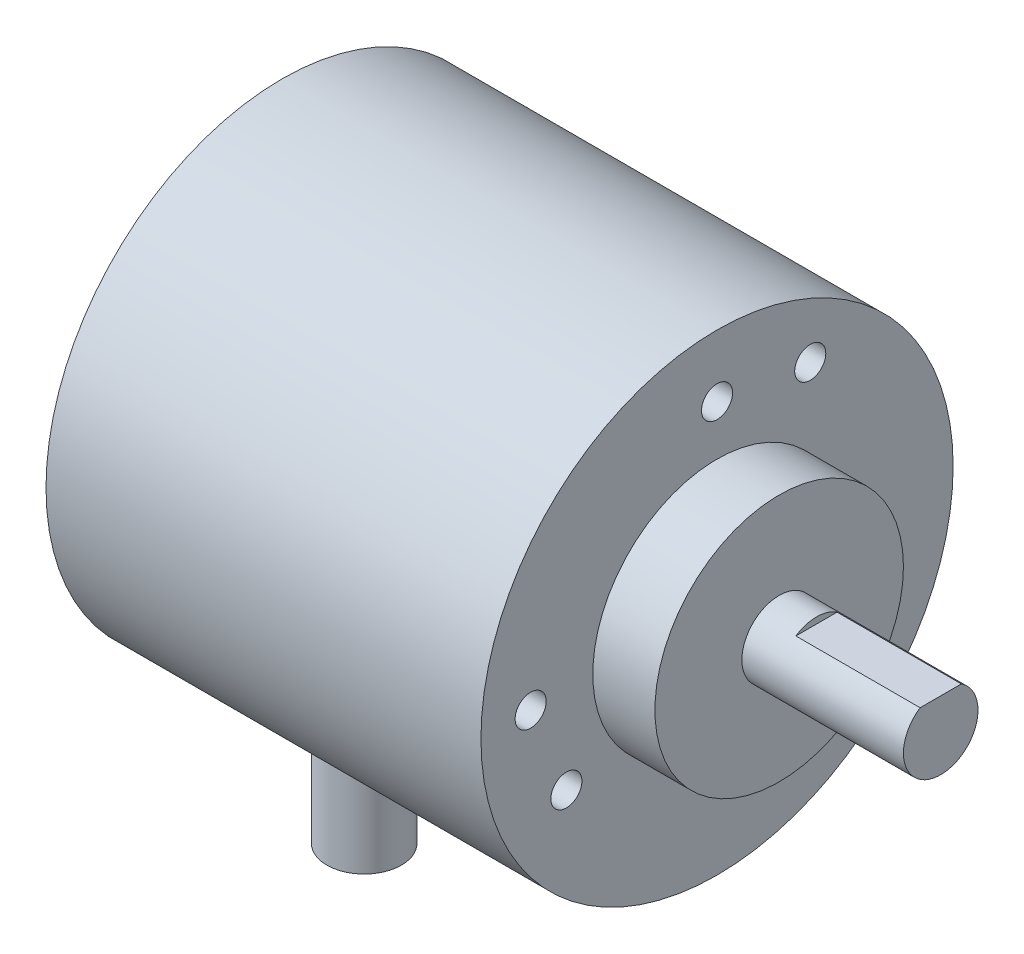
ISO-10303-21;
HEADER;
FILE_DESCRIPTION(('STEP AP214'),'2;1');
FILE_NAME('part.step','',(''),(''),'','','');
FILE_SCHEMA(('AUTOMOTIVE_DESIGN { 1 0 10303 214 1 1 1 1 }'));
ENDSEC;
DATA;
#1=APPLICATION_CONTEXT('core data for automotive mechanical design processes');
#2=APPLICATION_PROTOCOL_DEFINITION('international standard','automotive_design',2000,#1);
#3=PRODUCT_CONTEXT('',#1,'mechanical');
#4=PRODUCT('Part','Part','',(#3));
#5=PRODUCT_RELATED_PRODUCT_CATEGORY('part','',(#4));
#6=PRODUCT_DEFINITION_FORMATION('','',#4);
#7=PRODUCT_DEFINITION_CONTEXT('part definition',#1,'design');
#8=PRODUCT_DEFINITION('design','',#6,#7);
#9=PRODUCT_DEFINITION_SHAPE('','',#8);
#10=(LENGTH_UNIT() NAMED_UNIT(*) SI_UNIT(.MILLI.,.METRE.));
#11=(NAMED_UNIT(*) PLANE_ANGLE_UNIT() SI_UNIT($,.RADIAN.));
#12=(NAMED_UNIT(*) SI_UNIT($,.STERADIAN.) SOLID_ANGLE_UNIT());
#13=UNCERTAINTY_MEASURE_WITH_UNIT(LENGTH_MEASURE(1.E-05),#10,'distance_accuracy_value','');
#14=(GEOMETRIC_REPRESENTATION_CONTEXT(3) GLOBAL_UNCERTAINTY_ASSIGNED_CONTEXT((#13)) GLOBAL_UNIT_ASSIGNED_CONTEXT((#10,
#11,#12)) REPRESENTATION_CONTEXT('',''));
#15=CARTESIAN_POINT('',(0.,0.,0.));
#16=DIRECTION('',(0.,0.,1.));
#17=DIRECTION('',(1.,0.,0.));
#18=AXIS2_PLACEMENT_3D('',#15,#16,#17);
#19=CARTESIAN_POINT('',(35.,0.,0.));
#20=DIRECTION('',(-1.,0.,0.));
#21=DIRECTION('',(0.,0.,1.));
#22=AXIS2_PLACEMENT_3D('',#19,#20,#21);
#23=CYLINDRICAL_SURFACE('',#22,19.);
#24=CARTESIAN_POINT('',(35.,0.,0.));
#25=DIRECTION('',(1.,0.,0.));
#26=DIRECTION('',(0.,0.,-1.));
#27=AXIS2_PLACEMENT_3D('',#24,#25,#26);
#28=CIRCLE('',#27,19.);
#29=CARTESIAN_POINT('',(35.,0.,-19.));
#30=VERTEX_POINT('',#29);
#31=EDGE_CURVE('E155',#30,#30,#28,.T.);
#32=ORIENTED_EDGE('',*,*,#31,.F.);
#33=EDGE_LOOP('',(#32));
#34=FACE_BOUND('',#33,.T.);
#35=CARTESIAN_POINT('',(0.,0.,0.));
#36=DIRECTION('',(1.,0.,0.));
#37=DIRECTION('',(0.,0.,-1.));
#38=AXIS2_PLACEMENT_3D('',#35,#36,#37);
#39=CIRCLE('',#38,19.);
#40=CARTESIAN_POINT('',(0.,0.,-19.));
#41=VERTEX_POINT('',#40);
#42=EDGE_CURVE('E152',#41,#41,#39,.T.);
#43=ORIENTED_EDGE('',*,*,#42,.T.);
#44=EDGE_LOOP('',(#43));
#45=FACE_BOUND('',#44,.T.);
#46=CARTESIAN_POINT('',(6.60446508450785,-18.3303027798234,5.));
#47=CARTESIAN_POINT('',(6.32888223961991,-18.3303076805953,4.99999308500677));
#48=CARTESIAN_POINT('',(6.05322551473415,-18.3365854863742,4.97713861011087));
#49=CARTESIAN_POINT('',(5.50986334891869,-18.3609456765193,4.88649188132583));
#50=CARTESIAN_POINT('',(5.24216210886449,-18.3790341856388,4.8186763113874));
#51=CARTESIAN_POINT('',(4.72264961528557,-18.4248284451883,4.64048304058368));
#52=CARTESIAN_POINT('',(4.47081697200796,-18.4525209076366,4.53016412386276));
#53=CARTESIAN_POINT('',(3.98919706270166,-18.5143859747079,4.27027879418024));
#54=CARTESIAN_POINT('',(3.75941134575081,-18.5485590341742,4.12070962614153));
#55=CARTESIAN_POINT('',(3.32280966488077,-18.6204675881345,3.78267387215627));
#56=CARTESIAN_POINT('',(3.1166103016075,-18.6582649195373,3.59342388585161));
#57=CARTESIAN_POINT('',(2.73848134692244,-18.7326289048008,3.18308399185689));
#58=CARTESIAN_POINT('',(2.56655523113974,-18.7691954335344,2.9619908588848));
#59=CARTESIAN_POINT('',(2.25929236495211,-18.8376665200647,2.48997619441659));
#60=CARTESIAN_POINT('',(2.12456705007258,-18.8694896180478,2.23864380045132));
#61=CARTESIAN_POINT('',(1.89951512019479,-18.9241795978652,1.71591903904907));
#62=CARTESIAN_POINT('',(1.80918122152414,-18.9470479488548,1.44452997089107));
#63=CARTESIAN_POINT('',(1.67746752752788,-18.9808145661746,0.895829968221411));
#64=CARTESIAN_POINT('',(1.63503923217314,-18.9919688186818,0.618786751296977));
#65=CARTESIAN_POINT('',(1.59704399164556,-19.0019448383295,0.0613051843002851));
#66=CARTESIAN_POINT('',(1.60146940048377,-19.0007686176625,-0.219132604356021));
#67=CARTESIAN_POINT('',(1.65631419486616,-18.9864044245751,-0.768150348363934));
#68=CARTESIAN_POINT('',(1.70560099687437,-18.9735122491667,-1.03685236127676));
#69=CARTESIAN_POINT('',(1.84694176728334,-18.9375127663139,-1.56202860734408));
#70=CARTESIAN_POINT('',(1.93899814159152,-18.9144048842112,-1.81850215171817));
#71=CARTESIAN_POINT('',(2.16414331388676,-18.8601287056172,-2.31485231468228));
#72=CARTESIAN_POINT('',(2.29762338578461,-18.8288840247519,-2.55454275485878));
#73=CARTESIAN_POINT('',(2.60152739773804,-18.7617056682234,-3.00851095475854));
#74=CARTESIAN_POINT('',(2.7719583748566,-18.7257710999209,-3.22278386183337));
#75=CARTESIAN_POINT('',(3.15095142965821,-18.651843418341,-3.62659371027546));
#76=CARTESIAN_POINT('',(3.36050176111199,-18.6138208820637,-3.81519881086321));
#77=CARTESIAN_POINT('',(3.80865165947078,-18.5409756211942,-4.15481353726456));
#78=CARTESIAN_POINT('',(4.04725290213737,-18.5061530813929,-4.30582099277877));
#79=CARTESIAN_POINT('',(4.54871049969126,-18.4435351657063,-4.56663864700412));
#80=CARTESIAN_POINT('',(4.81170098932815,-18.4157822317673,-4.67620185723018));
#81=CARTESIAN_POINT('',(5.35328046446094,-18.3709765778432,-4.84925751435856));
#82=CARTESIAN_POINT('',(5.63186568020391,-18.3539212839528,-4.91276104402371));
#83=CARTESIAN_POINT('',(6.18802750635807,-18.3329885889333,-4.99030134209754));
#84=CARTESIAN_POINT('',(6.46539699760674,-18.3287417045968,-5.00572550484526));
#85=CARTESIAN_POINT('',(7.01875078337694,-18.3328968939475,-4.99048654118971));
#86=CARTESIAN_POINT('',(7.29473521800367,-18.3412976612888,-4.95982817454223));
#87=CARTESIAN_POINT('',(7.83218113964743,-18.3694453076326,-4.85451613718464));
#88=CARTESIAN_POINT('',(8.09381721777157,-18.38897839628,-4.78069079084493));
#89=CARTESIAN_POINT('',(8.60099510150022,-18.4369822081201,-4.59206897567044));
#90=CARTESIAN_POINT('',(8.84653484159055,-18.4654540756515,-4.4772672608005));
#91=CARTESIAN_POINT('',(9.32037059760146,-18.5288899597502,-4.20711613689476));
#92=CARTESIAN_POINT('',(9.54818300158469,-18.5639802772042,-4.05094882526937));
#93=CARTESIAN_POINT('',(9.974878023508,-18.6363994043013,-3.70351772903253));
#94=CARTESIAN_POINT('',(10.1737553387788,-18.6737286224816,-3.51224752592248));
#95=CARTESIAN_POINT('',(10.5426640101948,-18.7476872387914,-3.09363353540494));
#96=CARTESIAN_POINT('',(10.7117295130598,-18.7842676189968,-2.86542821938722));
#97=CARTESIAN_POINT('',(11.0091497307765,-18.8515301947264,-2.38306898930586));
#98=CARTESIAN_POINT('',(11.137506608822,-18.8822127036203,-2.12891645498665));
#99=CARTESIAN_POINT('',(11.3486997239402,-18.9340252528141,-1.60366333274377));
#100=CARTESIAN_POINT('',(11.4318737309809,-18.9552259584474,-1.33270586074633));
#101=CARTESIAN_POINT('',(11.551328115248,-18.9859968322295,-0.780020623408545));
#102=CARTESIAN_POINT('',(11.5876185928299,-18.9955695054375,-0.498295191333964));
#103=CARTESIAN_POINT('',(11.6116567990096,-19.0018908884273,0.058894774343788));
#104=CARTESIAN_POINT('',(11.6008231131775,-18.9990143713474,0.33429473442592));
#105=CARTESIAN_POINT('',(11.5342047308364,-18.9816045685193,0.879206376729929));
#106=CARTESIAN_POINT('',(11.4784216439951,-18.9670717001927,1.14871826945243));
#107=CARTESIAN_POINT('',(11.324281482662,-18.9280530349978,1.67254445475456));
#108=CARTESIAN_POINT('',(11.2262055351121,-18.9036330238155,1.92694669495628));
#109=CARTESIAN_POINT('',(10.9905152938698,-18.8473973277052,2.41582977104085));
#110=CARTESIAN_POINT('',(10.8528955693279,-18.8155806270478,2.650307864853));
#111=CARTESIAN_POINT('',(10.537834872924,-18.7469251850809,3.0993177046632));
#112=CARTESIAN_POINT('',(10.3594485649238,-18.7099770681623,3.31316936915914));
#113=CARTESIAN_POINT('',(9.96972049442121,-18.6356759840049,3.70838303428296));
#114=CARTESIAN_POINT('',(9.75837014445817,-18.5983229136377,3.88973654228783));
#115=CARTESIAN_POINT('',(9.30330724332333,-18.5265290175459,4.21861622686898));
#116=CARTESIAN_POINT('',(9.05900224117423,-18.4921669812419,4.36534133891126));
#117=CARTESIAN_POINT('',(8.54831827650479,-18.4313463587445,4.61542491286898));
#118=CARTESIAN_POINT('',(8.2819542515584,-18.4048824792127,4.71881243848213));
#119=CARTESIAN_POINT('',(7.7811253163606,-18.3666293418197,4.86534794305051));
#120=CARTESIAN_POINT('',(7.54888219564257,-18.3531154038055,4.91572577910092));
#121=CARTESIAN_POINT('',(7.07926565540245,-18.3349504872345,4.98305299273215));
#122=CARTESIAN_POINT('',(6.84189278918853,-18.3302985575757,5.00000595759497));
#123=CARTESIAN_POINT('',(6.60446508450785,-18.3303027798234,5.));
#124=B_SPLINE_CURVE_WITH_KNOTS('',3,(#46,#47,#48,#49,#50,#51,#52,#53,#54,#55,#56,#57,#58,#59,
#60,#61,#62,#63,#64,#65,#66,#67,#68,#69,#70,#71,#72,#73,#74,#75,#76,#77,#78,#79,#80,#81,#82,#83,
#84,#85,#86,#87,#88,#89,#90,#91,#92,#93,#94,#95,#96,#97,#98,#99,#100,#101,#102,#103,#104,#105,
#106,#107,#108,#109,#110,#111,#112,#113,#114,#115,#116,#117,#118,#119,#120,#121,#122,#123),
.UNSPECIFIED.,.T.,.F.,(4,2,2,2,2,2,2,2,2,2,2,2,2,2,2,2,2,2,2,2,2,2,2,2,2,2,2,2,2,2,2,2,2,2,2,2,
2,2,4),(0.,0.825875729213833,1.65218007870219,2.47734568890479,3.30256923512498,
4.14594894146806,4.98941413097255,5.84601327874805,6.70247183014164,7.53979807363678,
8.37698767716692,9.19361043121762,10.010279128133,10.8349094891791,11.6596970339541,
12.5091605137052,13.3586730168159,14.2131713149119,15.0674639375367,15.896865155935,
16.7261807133237,17.5400819311587,18.3540873868011,19.1855755433317,20.0172158876796,
20.8721888776521,21.7271164280558,22.5755616963676,23.4238241493332,24.2467308457638,
25.0696080746695,25.8870978502982,26.7046999517595,27.5436351933895,28.3827893521603,
29.2397824320042,30.0961998593059,30.8078073865499,31.5193385372587),.UNSPECIFIED.);
#125=CARTESIAN_POINT('',(6.60446508450785,-18.3303027798234,5.));
#126=VERTEX_POINT('',#125);
#127=EDGE_CURVE('E40',#126,#126,#124,.T.);
#128=ORIENTED_EDGE('',*,*,#127,.F.);
#129=EDGE_LOOP('',(#128));
#130=FACE_BOUND('',#129,.T.);
#131=ADVANCED_FACE('F36',(#34,#45,#130),#23,.T.);
#132=CARTESIAN_POINT('',(35.,0.,0.));
#133=DIRECTION('',(1.,0.,0.));
#134=DIRECTION('',(0.,0.,-1.));
#135=AXIS2_PLACEMENT_3D('',#132,#133,#134);
#136=PLANE('',#135);
#137=CARTESIAN_POINT('',(35.,1.39645239816133E-13,15.));
#138=DIRECTION('',(1.,0.,0.));
#139=DIRECTION('',(0.,0.,-1.));
#140=AXIS2_PLACEMENT_3D('',#137,#138,#139);
#141=CIRCLE('',#140,1.24999999999999);
#142=CARTESIAN_POINT('',(35.,1.39645239816133E-13,13.75));
#143=VERTEX_POINT('',#142);
#144=EDGE_CURVE('E97',#143,#143,#141,.T.);
#145=ORIENTED_EDGE('',*,*,#144,.F.);
#146=EDGE_LOOP('',(#145));
#147=FACE_BOUND('',#146,.T.);
#148=CARTESIAN_POINT('',(35.,-6.99999999999989,12.1243556529822));
#149=DIRECTION('',(1.,0.,0.));
#150=DIRECTION('',(0.,0.,-1.));
#151=AXIS2_PLACEMENT_3D('',#148,#149,#150);
#152=CIRCLE('',#151,1.24999999999999);
#153=CARTESIAN_POINT('',(35.,-6.99999999999989,10.8743556529822));
#154=VERTEX_POINT('',#153);
#155=EDGE_CURVE('E96',#154,#154,#152,.T.);
#156=ORIENTED_EDGE('',*,*,#155,.F.);
#157=EDGE_LOOP('',(#156));
#158=FACE_BOUND('',#157,.T.);
#159=CARTESIAN_POINT('',(35.,-12.9903810567666,-7.49999999999994));
#160=DIRECTION('',(1.,0.,0.));
#161=DIRECTION('',(0.,0.,-1.));
#162=AXIS2_PLACEMENT_3D('',#159,#160,#161);
#163=CIRCLE('',#162,1.24999999999999);
#164=CARTESIAN_POINT('',(35.,-12.9903810567666,-8.74999999999993));
#165=VERTEX_POINT('',#164);
#166=EDGE_CURVE('E107',#165,#165,#163,.T.);
#167=ORIENTED_EDGE('',*,*,#166,.F.);
#168=EDGE_LOOP('',(#167));
#169=FACE_BOUND('',#168,.T.);
#170=CARTESIAN_POINT('',(35.,-7.00000000000006,-12.1243556529821));
#171=DIRECTION('',(1.,0.,0.));
#172=DIRECTION('',(0.,0.,-1.));
#173=AXIS2_PLACEMENT_3D('',#170,#171,#172);
#174=CIRCLE('',#173,1.24999999999999);
#175=CARTESIAN_POINT('',(35.,-7.00000000000006,-13.3743556529821));
#176=VERTEX_POINT('',#175);
#177=EDGE_CURVE('E113',#176,#176,#174,.T.);
#178=ORIENTED_EDGE('',*,*,#177,.F.);
#179=EDGE_LOOP('',(#178));
#180=FACE_BOUND('',#179,.T.);
#181=CARTESIAN_POINT('',(35.,12.9903810567666,-7.5));
#182=DIRECTION('',(1.,0.,0.));
#183=DIRECTION('',(0.,0.,-1.));
#184=AXIS2_PLACEMENT_3D('',#181,#182,#183);
#185=CIRCLE('',#184,1.24999999999999);
#186=CARTESIAN_POINT('',(35.,12.9903810567666,-8.74999999999999));
#187=VERTEX_POINT('',#186);
#188=EDGE_CURVE('E119',#187,#187,#185,.T.);
#189=ORIENTED_EDGE('',*,*,#188,.F.);
#190=EDGE_LOOP('',(#189));
#191=FACE_BOUND('',#190,.T.);
#192=CARTESIAN_POINT('',(35.,14.,0.));
#193=DIRECTION('',(1.,0.,0.));
#194=DIRECTION('',(0.,0.,-1.));
#195=AXIS2_PLACEMENT_3D('',#192,#193,#194);
#196=CIRCLE('',#195,1.24999999999999);
#197=CARTESIAN_POINT('',(35.,14.,-1.24999999999999));
#198=VERTEX_POINT('',#197);
#199=EDGE_CURVE('E125',#198,#198,#196,.T.);
#200=ORIENTED_EDGE('',*,*,#199,.F.);
#201=EDGE_LOOP('',(#200));
#202=FACE_BOUND('',#201,.T.);
#203=CARTESIAN_POINT('',(35.,0.,0.));
#204=DIRECTION('',(1.,0.,0.));
#205=DIRECTION('',(0.,0.,-1.));
#206=AXIS2_PLACEMENT_3D('',#203,#204,#205);
#207=CIRCLE('',#206,10.);
#208=CARTESIAN_POINT('',(35.,0.,-10.));
#209=VERTEX_POINT('',#208);
#210=EDGE_CURVE('E149',#209,#209,#207,.T.);
#211=ORIENTED_EDGE('',*,*,#210,.F.);
#212=EDGE_LOOP('',(#211));
#213=FACE_BOUND('',#212,.T.);
#214=ORIENTED_EDGE('',*,*,#31,.T.);
#215=EDGE_LOOP('',(#214));
#216=FACE_BOUND('',#215,.T.);
#217=ADVANCED_FACE('F169',(#147,#158,#169,#180,#191,#202,#213,#216),#136,.T.);
#218=CARTESIAN_POINT('',(0.,0.,0.));
#219=DIRECTION('',(1.,0.,0.));
#220=DIRECTION('',(0.,0.,-1.));
#221=AXIS2_PLACEMENT_3D('',#218,#219,#220);
#222=PLANE('',#221);
#223=ORIENTED_EDGE('',*,*,#42,.F.);
#224=EDGE_LOOP('',(#223));
#225=FACE_BOUND('',#224,.T.);
#226=ADVANCED_FACE('F174',(#225),#222,.F.);
#227=CARTESIAN_POINT('',(40.,0.,0.));
#228=DIRECTION('',(-1.,0.,0.));
#229=DIRECTION('',(0.,0.,1.));
#230=AXIS2_PLACEMENT_3D('',#227,#228,#229);
#231=CYLINDRICAL_SURFACE('',#230,10.);
#232=CARTESIAN_POINT('',(40.,0.,0.));
#233=DIRECTION('',(1.,0.,0.));
#234=DIRECTION('',(0.,0.,-1.));
#235=AXIS2_PLACEMENT_3D('',#232,#233,#234);
#236=CIRCLE('',#235,10.);
#237=CARTESIAN_POINT('',(40.,0.,-10.));
#238=VERTEX_POINT('',#237);
#239=EDGE_CURVE('E144',#238,#238,#236,.T.);
#240=ORIENTED_EDGE('',*,*,#239,.F.);
#241=EDGE_LOOP('',(#240));
#242=FACE_BOUND('',#241,.T.);
#243=ORIENTED_EDGE('',*,*,#210,.T.);
#244=EDGE_LOOP('',(#243));
#245=FACE_BOUND('',#244,.T.);
#246=ADVANCED_FACE('F182',(#242,#245),#231,.T.);
#247=CARTESIAN_POINT('',(40.,0.,0.));
#248=DIRECTION('',(1.,0.,0.));
#249=DIRECTION('',(0.,0.,-1.));
#250=AXIS2_PLACEMENT_3D('',#247,#248,#249);
#251=PLANE('',#250);
#252=CARTESIAN_POINT('',(40.,0.,0.));
#253=DIRECTION('',(1.,0.,0.));
#254=DIRECTION('',(0.,0.,-1.));
#255=AXIS2_PLACEMENT_3D('',#252,#253,#254);
#256=CIRCLE('',#255,3.);
#257=CARTESIAN_POINT('',(40.,0.,-3.));
#258=VERTEX_POINT('',#257);
#259=EDGE_CURVE('E145',#258,#258,#256,.T.);
#260=ORIENTED_EDGE('',*,*,#259,.F.);
#261=EDGE_LOOP('',(#260));
#262=FACE_BOUND('',#261,.T.);
#263=ORIENTED_EDGE('',*,*,#239,.T.);
#264=EDGE_LOOP('',(#263));
#265=FACE_BOUND('',#264,.T.);
#266=ADVANCED_FACE('F186',(#262,#265),#251,.T.);
#267=CARTESIAN_POINT('',(53.,0.,0.));
#268=DIRECTION('',(-1.,0.,0.));
#269=DIRECTION('',(0.,0.,1.));
#270=AXIS2_PLACEMENT_3D('',#267,#268,#269);
#271=CYLINDRICAL_SURFACE('',#270,3.);
#272=CARTESIAN_POINT('',(53.,0.,0.));
#273=DIRECTION('',(1.,0.,0.));
#274=DIRECTION('',(0.,0.,-1.));
#275=AXIS2_PLACEMENT_3D('',#272,#273,#274);
#276=CIRCLE('',#275,3.);
#277=CARTESIAN_POINT('',(53.,2.5,1.6583123951777));
#278=VERTEX_POINT('',#277);
#279=CARTESIAN_POINT('',(53.,2.5,-1.6583123951777));
#280=VERTEX_POINT('',#279);
#281=EDGE_CURVE('E141',#278,#280,#276,.T.);
#282=ORIENTED_EDGE('',*,*,#281,.F.);
#283=DIRECTION('',(-1.,0.,0.));
#284=VECTOR('',#283,1.);
#285=CARTESIAN_POINT('',(53.,2.5,1.6583123951777));
#286=LINE('',#285,#284);
#287=CARTESIAN_POINT('',(43.,2.5,1.6583123951777));
#288=VERTEX_POINT('',#287);
#289=EDGE_CURVE('E56',#278,#288,#286,.T.);
#290=ORIENTED_EDGE('',*,*,#289,.T.);
#291=CARTESIAN_POINT('',(43.,0.,0.));
#292=DIRECTION('',(1.,0.,0.));
#293=DIRECTION('',(0.,0.,-1.));
#294=AXIS2_PLACEMENT_3D('',#291,#292,#293);
#295=CIRCLE('',#294,3.);
#296=CARTESIAN_POINT('',(43.,2.5,-1.6583123951777));
#297=VERTEX_POINT('',#296);
#298=EDGE_CURVE('E160',#297,#288,#295,.T.);
#299=ORIENTED_EDGE('',*,*,#298,.F.);
#300=DIRECTION('',(-1.,0.,0.));
#301=VECTOR('',#300,1.);
#302=CARTESIAN_POINT('',(53.,2.5,-1.6583123951777));
#303=LINE('',#302,#301);
#304=EDGE_CURVE('E61',#297,#280,#303,.F.);
#305=ORIENTED_EDGE('',*,*,#304,.T.);
#306=EDGE_LOOP('',(#282,#290,#299,#305));
#307=FACE_BOUND('',#306,.T.);
#308=ORIENTED_EDGE('',*,*,#259,.T.);
#309=EDGE_LOOP('',(#308));
#310=FACE_BOUND('',#309,.T.);
#311=ADVANCED_FACE('F192',(#307,#310),#271,.T.);
#312=CARTESIAN_POINT('',(53.,0.,0.));
#313=DIRECTION('',(1.,0.,0.));
#314=DIRECTION('',(0.,0.,-1.));
#315=AXIS2_PLACEMENT_3D('',#312,#313,#314);
#316=PLANE('',#315);
#317=DIRECTION('',(0.,0.,-1.));
#318=VECTOR('',#317,1.);
#319=CARTESIAN_POINT('',(53.,2.5,0.));
#320=LINE('',#319,#318);
#321=EDGE_CURVE('E148',#278,#280,#320,.T.);
#322=ORIENTED_EDGE('',*,*,#321,.F.);
#323=ORIENTED_EDGE('',*,*,#281,.T.);
#324=EDGE_LOOP('',(#322,#323));
#325=FACE_BOUND('',#324,.T.);
#326=ADVANCED_FACE('F196',(#325),#316,.T.);
#327=CARTESIAN_POINT('',(43.,0.,0.));
#328=DIRECTION('',(1.,0.,0.));
#329=DIRECTION('',(0.,0.,-1.));
#330=AXIS2_PLACEMENT_3D('',#327,#328,#329);
#331=PLANE('',#330);
#332=ORIENTED_EDGE('',*,*,#298,.T.);
#333=DIRECTION('',(0.,0.,-1.));
#334=VECTOR('',#333,1.);
#335=CARTESIAN_POINT('',(43.,2.5,5.48095029100151));
#336=LINE('',#335,#334);
#337=EDGE_CURVE('E137',#288,#297,#336,.T.);
#338=ORIENTED_EDGE('',*,*,#337,.T.);
#339=EDGE_LOOP('',(#332,#338));
#340=FACE_BOUND('',#339,.T.);
#341=ADVANCED_FACE('F200',(#340),#331,.T.);
#342=CARTESIAN_POINT('',(43.,2.5,5.48095029100151));
#343=DIRECTION('',(0.,-1.,0.));
#344=DIRECTION('',(0.,0.,-1.));
#345=AXIS2_PLACEMENT_3D('',#342,#343,#344);
#346=PLANE('',#345);
#347=ORIENTED_EDGE('',*,*,#321,.T.);
#348=ORIENTED_EDGE('',*,*,#304,.F.);
#349=ORIENTED_EDGE('',*,*,#337,.F.);
#350=ORIENTED_EDGE('',*,*,#289,.F.);
#351=EDGE_LOOP('',(#347,#348,#349,#350));
#352=FACE_BOUND('',#351,.T.);
#353=ADVANCED_FACE('F202',(#352),#346,.F.);
#354=CARTESIAN_POINT('',(6.60446508450785,-21.,0.));
#355=DIRECTION('',(0.,1.,0.));
#356=DIRECTION('',(0.,0.,1.));
#357=AXIS2_PLACEMENT_3D('',#354,#355,#356);
#358=CYLINDRICAL_SURFACE('',#357,5.);
#359=CARTESIAN_POINT('',(6.60446508450785,-21.,0.));
#360=DIRECTION('',(0.,-1.,0.));
#361=DIRECTION('',(0.,0.,-1.));
#362=AXIS2_PLACEMENT_3D('',#359,#360,#361);
#363=CIRCLE('',#362,5.);
#364=CARTESIAN_POINT('',(6.60446508450785,-21.,-5.));
#365=VERTEX_POINT('',#364);
#366=EDGE_CURVE('E133',#365,#365,#363,.T.);
#367=ORIENTED_EDGE('',*,*,#366,.F.);
#368=EDGE_LOOP('',(#367));
#369=FACE_BOUND('',#368,.T.);
#370=ORIENTED_EDGE('',*,*,#127,.T.);
#371=EDGE_LOOP('',(#370));
#372=FACE_BOUND('',#371,.T.);
#373=ADVANCED_FACE('F166',(#369,#372),#358,.T.);
#374=CARTESIAN_POINT('',(6.60446508450785,-21.,0.));
#375=DIRECTION('',(0.,-1.,0.));
#376=DIRECTION('',(0.,0.,-1.));
#377=AXIS2_PLACEMENT_3D('',#374,#375,#376);
#378=PLANE('',#377);
#379=CARTESIAN_POINT('',(6.60446508450785,-21.,0.));
#380=DIRECTION('',(0.,-1.,0.));
#381=DIRECTION('',(0.,0.,-1.));
#382=AXIS2_PLACEMENT_3D('',#379,#380,#381);
#383=CIRCLE('',#382,3.);
#384=CARTESIAN_POINT('',(6.60446508450785,-21.,-3.));
#385=VERTEX_POINT('',#384);
#386=EDGE_CURVE('E11',#385,#385,#383,.T.);
#387=ORIENTED_EDGE('',*,*,#386,.F.);
#388=EDGE_LOOP('',(#387));
#389=FACE_BOUND('',#388,.T.);
#390=ORIENTED_EDGE('',*,*,#366,.T.);
#391=EDGE_LOOP('',(#390));
#392=FACE_BOUND('',#391,.T.);
#393=ADVANCED_FACE('F209',(#389,#392),#378,.T.);
#394=CARTESIAN_POINT('',(6.60446508450785,-31.,0.));
#395=DIRECTION('',(0.,1.,0.));
#396=DIRECTION('',(0.,0.,1.));
#397=AXIS2_PLACEMENT_3D('',#394,#395,#396);
#398=CYLINDRICAL_SURFACE('',#397,3.);
#399=CARTESIAN_POINT('',(6.60446508450785,-31.,0.));
#400=DIRECTION('',(0.,-1.,0.));
#401=DIRECTION('',(0.,0.,-1.));
#402=AXIS2_PLACEMENT_3D('',#399,#400,#401);
#403=CIRCLE('',#402,3.);
#404=CARTESIAN_POINT('',(6.60446508450785,-31.,-3.));
#405=VERTEX_POINT('',#404);
#406=EDGE_CURVE('E131',#405,#405,#403,.T.);
#407=ORIENTED_EDGE('',*,*,#406,.F.);
#408=EDGE_LOOP('',(#407));
#409=FACE_BOUND('',#408,.T.);
#410=ORIENTED_EDGE('',*,*,#386,.T.);
#411=EDGE_LOOP('',(#410));
#412=FACE_BOUND('',#411,.T.);
#413=ADVANCED_FACE('F213',(#409,#412),#398,.T.);
#414=CARTESIAN_POINT('',(6.60446508450785,-31.,0.));
#415=DIRECTION('',(0.,-1.,0.));
#416=DIRECTION('',(0.,0.,-1.));
#417=AXIS2_PLACEMENT_3D('',#414,#415,#416);
#418=PLANE('',#417);
#419=ORIENTED_EDGE('',*,*,#406,.T.);
#420=EDGE_LOOP('',(#419));
#421=FACE_BOUND('',#420,.T.);
#422=ADVANCED_FACE('F217',(#421),#418,.T.);
#423=CARTESIAN_POINT('',(27.5,14.,0.));
#424=DIRECTION('',(1.,0.,0.));
#425=DIRECTION('',(0.,0.,-1.));
#426=AXIS2_PLACEMENT_3D('',#423,#424,#425);
#427=CONICAL_SURFACE('',#426,1.25,1.02974425867665);
#428=CARTESIAN_POINT('',(26.7489242262156,14.,0.));
#429=VERTEX_POINT('',#428);
#430=VERTEX_LOOP('',#429);
#431=FACE_BOUND('',#430,.T.);
#432=CARTESIAN_POINT('',(27.5,14.,0.));
#433=DIRECTION('',(1.,0.,0.));
#434=DIRECTION('',(0.,0.,-1.));
#435=AXIS2_PLACEMENT_3D('',#432,#433,#434);
#436=CIRCLE('',#435,1.25);
#437=CARTESIAN_POINT('',(27.5,14.,-1.25));
#438=VERTEX_POINT('',#437);
#439=EDGE_CURVE('E128',#438,#438,#436,.T.);
#440=ORIENTED_EDGE('',*,*,#439,.T.);
#441=EDGE_LOOP('',(#440));
#442=FACE_BOUND('',#441,.T.);
#443=ADVANCED_FACE('F221',(#431,#442),#427,.F.);
#444=CARTESIAN_POINT('',(35.,14.,0.));
#445=DIRECTION('',(1.,0.,0.));
#446=DIRECTION('',(0.,0.,-1.));
#447=AXIS2_PLACEMENT_3D('',#444,#445,#446);
#448=CYLINDRICAL_SURFACE('',#447,1.24999999999999);
#449=ORIENTED_EDGE('',*,*,#439,.F.);
#450=EDGE_LOOP('',(#449));
#451=FACE_BOUND('',#450,.T.);
#452=ORIENTED_EDGE('',*,*,#199,.T.);
#453=EDGE_LOOP('',(#452));
#454=FACE_BOUND('',#453,.T.);
#455=ADVANCED_FACE('F225',(#451,#454),#448,.F.);
#456=CARTESIAN_POINT('',(27.5,12.9903810567666,-7.5));
#457=DIRECTION('',(1.,0.,0.));
#458=DIRECTION('',(0.,0.,-1.));
#459=AXIS2_PLACEMENT_3D('',#456,#457,#458);
#460=CONICAL_SURFACE('',#459,1.25,1.02974425867665);
#461=CARTESIAN_POINT('',(26.7489242262156,12.9903810567666,-7.5));
#462=VERTEX_POINT('',#461);
#463=VERTEX_LOOP('',#462);
#464=FACE_BOUND('',#463,.T.);
#465=CARTESIAN_POINT('',(27.5,12.9903810567666,-7.5));
#466=DIRECTION('',(1.,0.,0.));
#467=DIRECTION('',(0.,0.,-1.));
#468=AXIS2_PLACEMENT_3D('',#465,#466,#467);
#469=CIRCLE('',#468,1.25);
#470=CARTESIAN_POINT('',(27.5,12.9903810567666,-8.75));
#471=VERTEX_POINT('',#470);
#472=EDGE_CURVE('E122',#471,#471,#469,.T.);
#473=ORIENTED_EDGE('',*,*,#472,.T.);
#474=EDGE_LOOP('',(#473));
#475=FACE_BOUND('',#474,.T.);
#476=ADVANCED_FACE('F229',(#464,#475),#460,.F.);
#477=CARTESIAN_POINT('',(35.,12.9903810567666,-7.5));
#478=DIRECTION('',(1.,0.,0.));
#479=DIRECTION('',(0.,0.,-1.));
#480=AXIS2_PLACEMENT_3D('',#477,#478,#479);
#481=CYLINDRICAL_SURFACE('',#480,1.24999999999999);
#482=ORIENTED_EDGE('',*,*,#472,.F.);
#483=EDGE_LOOP('',(#482));
#484=FACE_BOUND('',#483,.T.);
#485=ORIENTED_EDGE('',*,*,#188,.T.);
#486=EDGE_LOOP('',(#485));
#487=FACE_BOUND('',#486,.T.);
#488=ADVANCED_FACE('F233',(#484,#487),#481,.F.);
#489=CARTESIAN_POINT('',(27.5,-7.00000000000006,-12.1243556529821));
#490=DIRECTION('',(1.,0.,0.));
#491=DIRECTION('',(0.,0.,-1.));
#492=AXIS2_PLACEMENT_3D('',#489,#490,#491);
#493=CONICAL_SURFACE('',#492,1.25,1.02974425867665);
#494=CARTESIAN_POINT('',(26.7489242262156,-7.00000000000006,-12.1243556529821));
#495=VERTEX_POINT('',#494);
#496=VERTEX_LOOP('',#495);
#497=FACE_BOUND('',#496,.T.);
#498=CARTESIAN_POINT('',(27.5,-7.00000000000006,-12.1243556529821));
#499=DIRECTION('',(1.,0.,0.));
#500=DIRECTION('',(0.,0.,-1.));
#501=AXIS2_PLACEMENT_3D('',#498,#499,#500);
#502=CIRCLE('',#501,1.25);
#503=CARTESIAN_POINT('',(27.5,-7.00000000000006,-13.3743556529821));
#504=VERTEX_POINT('',#503);
#505=EDGE_CURVE('E116',#504,#504,#502,.T.);
#506=ORIENTED_EDGE('',*,*,#505,.T.);
#507=EDGE_LOOP('',(#506));
#508=FACE_BOUND('',#507,.T.);
#509=ADVANCED_FACE('F237',(#497,#508),#493,.F.);
#510=CARTESIAN_POINT('',(35.,-7.00000000000006,-12.1243556529821));
#511=DIRECTION('',(1.,0.,0.));
#512=DIRECTION('',(0.,0.,-1.));
#513=AXIS2_PLACEMENT_3D('',#510,#511,#512);
#514=CYLINDRICAL_SURFACE('',#513,1.24999999999999);
#515=ORIENTED_EDGE('',*,*,#505,.F.);
#516=EDGE_LOOP('',(#515));
#517=FACE_BOUND('',#516,.T.);
#518=ORIENTED_EDGE('',*,*,#177,.T.);
#519=EDGE_LOOP('',(#518));
#520=FACE_BOUND('',#519,.T.);
#521=ADVANCED_FACE('F241',(#517,#520),#514,.F.);
#522=CARTESIAN_POINT('',(27.5,-12.9903810567666,-7.49999999999994));
#523=DIRECTION('',(1.,0.,0.));
#524=DIRECTION('',(0.,0.,-1.));
#525=AXIS2_PLACEMENT_3D('',#522,#523,#524);
#526=CONICAL_SURFACE('',#525,1.25,1.02974425867665);
#527=CARTESIAN_POINT('',(26.7489242262156,-12.9903810567666,-7.49999999999994));
#528=VERTEX_POINT('',#527);
#529=VERTEX_LOOP('',#528);
#530=FACE_BOUND('',#529,.T.);
#531=CARTESIAN_POINT('',(27.5,-12.9903810567666,-7.49999999999994));
#532=DIRECTION('',(1.,0.,0.));
#533=DIRECTION('',(0.,0.,-1.));
#534=AXIS2_PLACEMENT_3D('',#531,#532,#533);
#535=CIRCLE('',#534,1.25);
#536=CARTESIAN_POINT('',(27.5,-12.9903810567666,-8.74999999999994));
#537=VERTEX_POINT('',#536);
#538=EDGE_CURVE('E110',#537,#537,#535,.T.);
#539=ORIENTED_EDGE('',*,*,#538,.T.);
#540=EDGE_LOOP('',(#539));
#541=FACE_BOUND('',#540,.T.);
#542=ADVANCED_FACE('F245',(#530,#541),#526,.F.);
#543=CARTESIAN_POINT('',(35.,-12.9903810567666,-7.49999999999994));
#544=DIRECTION('',(1.,0.,0.));
#545=DIRECTION('',(0.,0.,-1.));
#546=AXIS2_PLACEMENT_3D('',#543,#544,#545);
#547=CYLINDRICAL_SURFACE('',#546,1.24999999999999);
#548=ORIENTED_EDGE('',*,*,#538,.F.);
#549=EDGE_LOOP('',(#548));
#550=FACE_BOUND('',#549,.T.);
#551=ORIENTED_EDGE('',*,*,#166,.T.);
#552=EDGE_LOOP('',(#551));
#553=FACE_BOUND('',#552,.T.);
#554=ADVANCED_FACE('F249',(#550,#553),#547,.F.);
#555=CARTESIAN_POINT('',(27.5,-6.99999999999989,12.1243556529822));
#556=DIRECTION('',(1.,0.,0.));
#557=DIRECTION('',(0.,0.,-1.));
#558=AXIS2_PLACEMENT_3D('',#555,#556,#557);
#559=CONICAL_SURFACE('',#558,1.25,1.02974425867665);
#560=CARTESIAN_POINT('',(26.7489242262156,-6.99999999999989,12.1243556529822));
#561=VERTEX_POINT('',#560);
#562=VERTEX_LOOP('',#561);
#563=FACE_BOUND('',#562,.T.);
#564=CARTESIAN_POINT('',(27.5,-6.99999999999989,12.1243556529822));
#565=DIRECTION('',(1.,0.,0.));
#566=DIRECTION('',(0.,0.,-1.));
#567=AXIS2_PLACEMENT_3D('',#564,#565,#566);
#568=CIRCLE('',#567,1.25);
#569=CARTESIAN_POINT('',(27.5,-6.99999999999989,10.8743556529822));
#570=VERTEX_POINT('',#569);
#571=EDGE_CURVE('E100',#570,#570,#568,.T.);
#572=ORIENTED_EDGE('',*,*,#571,.T.);
#573=EDGE_LOOP('',(#572));
#574=FACE_BOUND('',#573,.T.);
#575=ADVANCED_FACE('F253',(#563,#574),#559,.F.);
#576=CARTESIAN_POINT('',(35.,-6.99999999999989,12.1243556529822));
#577=DIRECTION('',(1.,0.,0.));
#578=DIRECTION('',(0.,0.,-1.));
#579=AXIS2_PLACEMENT_3D('',#576,#577,#578);
#580=CYLINDRICAL_SURFACE('',#579,1.24999999999999);
#581=ORIENTED_EDGE('',*,*,#571,.F.);
#582=EDGE_LOOP('',(#581));
#583=FACE_BOUND('',#582,.T.);
#584=ORIENTED_EDGE('',*,*,#155,.T.);
#585=EDGE_LOOP('',(#584));
#586=FACE_BOUND('',#585,.T.);
#587=ADVANCED_FACE('F90',(#583,#586),#580,.F.);
#588=CARTESIAN_POINT('',(27.5,1.39645239816133E-13,15.));
#589=DIRECTION('',(1.,0.,0.));
#590=DIRECTION('',(0.,0.,-1.));
#591=AXIS2_PLACEMENT_3D('',#588,#589,#590);
#592=CONICAL_SURFACE('',#591,1.25,1.02974425867665);
#593=CARTESIAN_POINT('',(26.7489242262156,1.37624309108955E-13,15.));
#594=VERTEX_POINT('',#593);
#595=VERTEX_LOOP('',#594);
#596=FACE_BOUND('',#595,.T.);
#597=CARTESIAN_POINT('',(27.5,1.39645239816133E-13,15.));
#598=DIRECTION('',(1.,0.,0.));
#599=DIRECTION('',(0.,0.,-1.));
#600=AXIS2_PLACEMENT_3D('',#597,#598,#599);
#601=CIRCLE('',#600,1.25);
#602=CARTESIAN_POINT('',(27.5,1.39645239816133E-13,13.75));
#603=VERTEX_POINT('',#602);
#604=EDGE_CURVE('E94',#603,#603,#601,.T.);
#605=ORIENTED_EDGE('',*,*,#604,.T.);
#606=EDGE_LOOP('',(#605));
#607=FACE_BOUND('',#606,.T.);
#608=ADVANCED_FACE('F86',(#596,#607),#592,.F.);
#609=CARTESIAN_POINT('',(35.,1.39645239816133E-13,15.));
#610=DIRECTION('',(1.,0.,0.));
#611=DIRECTION('',(0.,0.,-1.));
#612=AXIS2_PLACEMENT_3D('',#609,#610,#611);
#613=CYLINDRICAL_SURFACE('',#612,1.24999999999999);
#614=ORIENTED_EDGE('',*,*,#604,.F.);
#615=EDGE_LOOP('',(#614));
#616=FACE_BOUND('',#615,.T.);
#617=ORIENTED_EDGE('',*,*,#144,.T.);
#618=EDGE_LOOP('',(#617));
#619=FACE_BOUND('',#618,.T.);
#620=ADVANCED_FACE('F89',(#616,#619),#613,.F.);
#621=CLOSED_SHELL('',(#131,#217,#226,#246,#266,#311,#326,#341,#353,#373,#393,#413,#422,#443,
#455,#476,#488,#509,#521,#542,#554,#575,#587,#608,#620));
#622=MANIFOLD_SOLID_BREP('B2',#621);
#623=ADVANCED_BREP_SHAPE_REPRESENTATION('',(#18,#622),#14);
#624=SHAPE_DEFINITION_REPRESENTATION(#9,#623);
ENDSEC;
END-ISO-10303-21;
